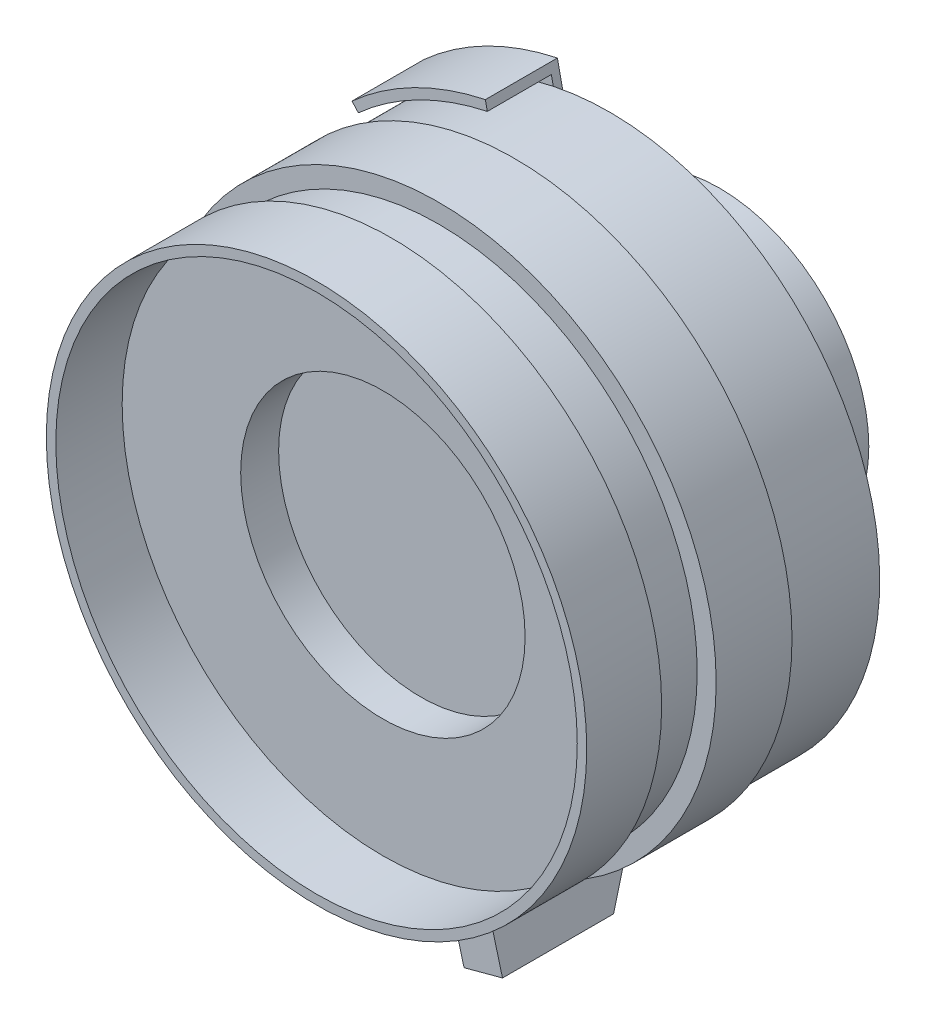
ISO-10303-21;
HEADER;
FILE_DESCRIPTION(('STEP AP214'),'2;1');
FILE_NAME('part.step','',(''),(''),'','','');
FILE_SCHEMA(('AUTOMOTIVE_DESIGN { 1 0 10303 214 1 1 1 1 }'));
ENDSEC;
DATA;
#1=APPLICATION_CONTEXT('core data for automotive mechanical design processes');
#2=APPLICATION_PROTOCOL_DEFINITION('international standard','automotive_design',2000,#1);
#3=PRODUCT_CONTEXT('',#1,'mechanical');
#4=PRODUCT('Part','Part','',(#3));
#5=PRODUCT_RELATED_PRODUCT_CATEGORY('part','',(#4));
#6=PRODUCT_DEFINITION_FORMATION('','',#4);
#7=PRODUCT_DEFINITION_CONTEXT('part definition',#1,'design');
#8=PRODUCT_DEFINITION('design','',#6,#7);
#9=PRODUCT_DEFINITION_SHAPE('','',#8);
#10=(LENGTH_UNIT() NAMED_UNIT(*) SI_UNIT(.MILLI.,.METRE.));
#11=(NAMED_UNIT(*) PLANE_ANGLE_UNIT() SI_UNIT($,.RADIAN.));
#12=(NAMED_UNIT(*) SI_UNIT($,.STERADIAN.) SOLID_ANGLE_UNIT());
#13=UNCERTAINTY_MEASURE_WITH_UNIT(LENGTH_MEASURE(1.E-05),#10,'distance_accuracy_value','');
#14=(GEOMETRIC_REPRESENTATION_CONTEXT(3) GLOBAL_UNCERTAINTY_ASSIGNED_CONTEXT((#13)) GLOBAL_UNIT_ASSIGNED_CONTEXT((#10,
#11,#12)) REPRESENTATION_CONTEXT('',''));
#15=CARTESIAN_POINT('',(0.,0.,0.));
#16=DIRECTION('',(0.,0.,1.));
#17=DIRECTION('',(1.,0.,0.));
#18=AXIS2_PLACEMENT_3D('',#15,#16,#17);
#19=CARTESIAN_POINT('',(0.,0.,11.6));
#20=DIRECTION('',(0.,0.,-1.));
#21=DIRECTION('',(-1.,0.,0.));
#22=AXIS2_PLACEMENT_3D('',#19,#20,#21);
#23=PLANE('',#22);
#24=CARTESIAN_POINT('',(0.,0.,11.6));
#25=DIRECTION('',(0.,0.,-1.));
#26=DIRECTION('',(1.,0.,0.));
#27=AXIS2_PLACEMENT_3D('',#24,#25,#26);
#28=CIRCLE('',#27,29.5);
#29=CARTESIAN_POINT('',(-19.7393528875864,21.922772351583,11.6));
#30=VERTEX_POINT('',#29);
#31=CARTESIAN_POINT('',(-6.13339487912422,28.8553542216472,11.6));
#32=VERTEX_POINT('',#31);
#33=EDGE_CURVE('E235',#30,#32,#28,.T.);
#34=ORIENTED_EDGE('',*,*,#33,.F.);
#35=DIRECTION('',(-0.669130606358862,0.743144825477391,0.));
#36=VECTOR('',#35,1.);
#37=CARTESIAN_POINT('',(-16.3936998557921,18.2070482241961,11.6));
#38=LINE('',#37,#36);
#39=CARTESIAN_POINT('',(-19.0702222812276,21.1796275261056,11.6));
#40=VERTEX_POINT('',#39);
#41=EDGE_CURVE('E271',#40,#30,#38,.T.);
#42=ORIENTED_EDGE('',*,*,#41,.F.);
#43=CARTESIAN_POINT('',(0.,0.,11.6));
#44=DIRECTION('',(0.,0.,1.));
#45=DIRECTION('',(1.,0.,0.));
#46=AXIS2_PLACEMENT_3D('',#43,#44,#45);
#47=CIRCLE('',#46,28.5);
#48=CARTESIAN_POINT('',(-5.92548318830645,27.8772066209134,11.6));
#49=VERTEX_POINT('',#48);
#50=EDGE_CURVE('E329',#49,#40,#47,.T.);
#51=ORIENTED_EDGE('',*,*,#50,.F.);
#52=DIRECTION('',(0.20791169081777,-0.978147600733803,0.));
#53=VECTOR('',#52,1.);
#54=CARTESIAN_POINT('',(-6.34130656994199,29.833501822381,11.6));
#55=LINE('',#54,#53);
#56=EDGE_CURVE('E246',#32,#49,#55,.T.);
#57=ORIENTED_EDGE('',*,*,#56,.F.);
#58=EDGE_LOOP('',(#34,#42,#51,#57));
#59=FACE_BOUND('',#58,.T.);
#60=ADVANCED_FACE('F41',(#59),#23,.F.);
#61=CARTESIAN_POINT('',(0.,0.,11.6));
#62=DIRECTION('',(0.,0.,1.));
#63=DIRECTION('',(1.,0.,0.));
#64=AXIS2_PLACEMENT_3D('',#61,#62,#63);
#65=PLANE('',#64);
#66=CARTESIAN_POINT('',(9.38473534577297,-26.9105321851835,11.6));
#67=VERTEX_POINT('',#66);
#68=EDGE_CURVE('E324',#67,#49,#47,.T.);
#69=ORIENTED_EDGE('',*,*,#68,.F.);
#70=DIRECTION('',(-0.258819045102524,0.965925826289068,0.));
#71=VECTOR('',#70,1.);
#72=CARTESIAN_POINT('',(2.02844423520706,0.543519994715305,11.6));
#73=LINE('',#72,#71);
#74=CARTESIAN_POINT('',(8.2162766283337,-22.5497848851535,11.6));
#75=VERTEX_POINT('',#74);
#76=EDGE_CURVE('E232',#67,#75,#73,.T.);
#77=ORIENTED_EDGE('',*,*,#76,.T.);
#78=CARTESIAN_POINT('',(0.,0.,11.6));
#79=DIRECTION('',(0.,0.,1.));
#80=DIRECTION('',(1.,0.,0.));
#81=AXIS2_PLACEMENT_3D('',#78,#79,#80);
#82=CIRCLE('',#81,24.);
#83=CARTESIAN_POINT('',(4.15938815791962,-23.6368248745841,11.6));
#84=VERTEX_POINT('',#83);
#85=EDGE_CURVE('E332',#75,#84,#82,.T.);
#86=ORIENTED_EDGE('',*,*,#85,.T.);
#87=DIRECTION('',(0.258819045102525,-0.965925826289067,0.));
#88=VECTOR('',#87,1.);
#89=CARTESIAN_POINT('',(-2.02844423520704,-0.543519994715302,11.6));
#90=LINE('',#89,#88);
#91=CARTESIAN_POINT('',(5.32784687535888,-27.9975721746142,11.6));
#92=VERTEX_POINT('',#91);
#93=EDGE_CURVE('E229',#84,#92,#90,.T.);
#94=ORIENTED_EDGE('',*,*,#93,.T.);
#95=EDGE_CURVE('E331',#40,#92,#47,.T.);
#96=ORIENTED_EDGE('',*,*,#95,.F.);
#97=CARTESIAN_POINT('',(-16.3936998557921,18.2070482241961,11.6));
#98=VERTEX_POINT('',#97);
#99=EDGE_CURVE('E259',#98,#40,#38,.T.);
#100=ORIENTED_EDGE('',*,*,#99,.F.);
#101=CARTESIAN_POINT('',(0.,0.,11.6));
#102=DIRECTION('',(0.,0.,1.));
#103=DIRECTION('',(-1.,0.,0.));
#104=AXIS2_PLACEMENT_3D('',#101,#102,#103);
#105=CIRCLE('',#104,24.5);
#106=CARTESIAN_POINT('',(-5.09383642503537,23.9646162179782,11.6));
#107=VERTEX_POINT('',#106);
#108=EDGE_CURVE('E268',#107,#98,#105,.T.);
#109=ORIENTED_EDGE('',*,*,#108,.F.);
#110=DIRECTION('',(0.20791169081777,-0.978147600733803,0.));
#111=VECTOR('',#110,1.);
#112=CARTESIAN_POINT('',(0.,0.,11.6));
#113=LINE('',#112,#111);
#114=EDGE_CURVE('E314',#49,#107,#113,.T.);
#115=ORIENTED_EDGE('',*,*,#114,.F.);
#116=EDGE_LOOP('',(#69,#77,#86,#94,#96,#100,#109,#115));
#117=FACE_BOUND('',#116,.T.);
#118=ADVANCED_FACE('F412',(#117),#65,.F.);
#119=CARTESIAN_POINT('',(0.,0.,4.5));
#120=DIRECTION('',(0.,0.,-1.));
#121=DIRECTION('',(-1.,0.,0.));
#122=AXIS2_PLACEMENT_3D('',#119,#120,#121);
#123=CYLINDRICAL_SURFACE('',#122,15.75);
#124=CARTESIAN_POINT('',(0.,0.,4.5));
#125=DIRECTION('',(0.,0.,1.));
#126=DIRECTION('',(1.,0.,0.));
#127=AXIS2_PLACEMENT_3D('',#124,#125,#126);
#128=CIRCLE('',#127,15.75);
#129=CARTESIAN_POINT('',(15.75,0.,4.5));
#130=VERTEX_POINT('',#129);
#131=EDGE_CURVE('E350',#130,#130,#128,.T.);
#132=ORIENTED_EDGE('',*,*,#131,.F.);
#133=EDGE_LOOP('',(#132));
#134=FACE_BOUND('',#133,.T.);
#135=CARTESIAN_POINT('',(0.,0.,0.));
#136=DIRECTION('',(0.,0.,1.));
#137=DIRECTION('',(1.,0.,0.));
#138=AXIS2_PLACEMENT_3D('',#135,#136,#137);
#139=CIRCLE('',#138,15.75);
#140=CARTESIAN_POINT('',(15.75,0.,0.));
#141=VERTEX_POINT('',#140);
#142=EDGE_CURVE('E347',#141,#141,#139,.T.);
#143=ORIENTED_EDGE('',*,*,#142,.T.);
#144=EDGE_LOOP('',(#143));
#145=FACE_BOUND('',#144,.T.);
#146=ADVANCED_FACE('F43',(#134,#145),#123,.T.);
#147=CARTESIAN_POINT('',(0.,0.,0.));
#148=DIRECTION('',(0.,0.,1.));
#149=DIRECTION('',(1.,0.,0.));
#150=AXIS2_PLACEMENT_3D('',#147,#148,#149);
#151=PLANE('',#150);
#152=CARTESIAN_POINT('',(0.,0.,0.));
#153=DIRECTION('',(0.,0.,-1.));
#154=DIRECTION('',(-1.,0.,0.));
#155=AXIS2_PLACEMENT_3D('',#152,#153,#154);
#156=CIRCLE('',#155,14.75);
#157=CARTESIAN_POINT('',(-14.75,0.,0.));
#158=VERTEX_POINT('',#157);
#159=EDGE_CURVE('E293',#158,#158,#156,.T.);
#160=ORIENTED_EDGE('',*,*,#159,.F.);
#161=EDGE_LOOP('',(#160));
#162=FACE_BOUND('',#161,.T.);
#163=ORIENTED_EDGE('',*,*,#142,.F.);
#164=EDGE_LOOP('',(#163));
#165=FACE_BOUND('',#164,.T.);
#166=ADVANCED_FACE('F550',(#162,#165),#151,.F.);
#167=CARTESIAN_POINT('',(0.,0.,10.5));
#168=DIRECTION('',(0.,0.,-1.));
#169=DIRECTION('',(-1.,0.,0.));
#170=AXIS2_PLACEMENT_3D('',#167,#168,#169);
#171=CYLINDRICAL_SURFACE('',#170,16.3);
#172=CARTESIAN_POINT('',(0.,0.,10.5));
#173=DIRECTION('',(0.,0.,1.));
#174=DIRECTION('',(1.,0.,0.));
#175=AXIS2_PLACEMENT_3D('',#172,#173,#174);
#176=CIRCLE('',#175,16.3);
#177=CARTESIAN_POINT('',(16.3,0.,10.5));
#178=VERTEX_POINT('',#177);
#179=EDGE_CURVE('E344',#178,#178,#176,.T.);
#180=ORIENTED_EDGE('',*,*,#179,.F.);
#181=EDGE_LOOP('',(#180));
#182=FACE_BOUND('',#181,.T.);
#183=CARTESIAN_POINT('',(0.,0.,4.5));
#184=DIRECTION('',(0.,0.,1.));
#185=DIRECTION('',(1.,0.,0.));
#186=AXIS2_PLACEMENT_3D('',#183,#184,#185);
#187=CIRCLE('',#186,16.3);
#188=CARTESIAN_POINT('',(16.3,0.,4.5));
#189=VERTEX_POINT('',#188);
#190=EDGE_CURVE('E341',#189,#189,#187,.T.);
#191=ORIENTED_EDGE('',*,*,#190,.T.);
#192=EDGE_LOOP('',(#191));
#193=FACE_BOUND('',#192,.T.);
#194=ADVANCED_FACE('F547',(#182,#193),#171,.T.);
#195=CARTESIAN_POINT('',(0.,0.,4.5));
#196=DIRECTION('',(0.,0.,1.));
#197=DIRECTION('',(1.,0.,0.));
#198=AXIS2_PLACEMENT_3D('',#195,#196,#197);
#199=PLANE('',#198);
#200=ORIENTED_EDGE('',*,*,#131,.T.);
#201=EDGE_LOOP('',(#200));
#202=FACE_BOUND('',#201,.T.);
#203=ORIENTED_EDGE('',*,*,#190,.F.);
#204=EDGE_LOOP('',(#203));
#205=FACE_BOUND('',#204,.T.);
#206=ADVANCED_FACE('F543',(#202,#205),#199,.F.);
#207=CARTESIAN_POINT('',(0.,0.,11.));
#208=DIRECTION('',(0.,0.,-1.));
#209=DIRECTION('',(-1.,0.,0.));
#210=AXIS2_PLACEMENT_3D('',#207,#208,#209);
#211=CYLINDRICAL_SURFACE('',#210,19.);
#212=CARTESIAN_POINT('',(0.,0.,11.));
#213=DIRECTION('',(0.,0.,1.));
#214=DIRECTION('',(1.,0.,0.));
#215=AXIS2_PLACEMENT_3D('',#212,#213,#214);
#216=CIRCLE('',#215,19.);
#217=CARTESIAN_POINT('',(19.,0.,11.));
#218=VERTEX_POINT('',#217);
#219=EDGE_CURVE('E338',#218,#218,#216,.T.);
#220=ORIENTED_EDGE('',*,*,#219,.F.);
#221=EDGE_LOOP('',(#220));
#222=FACE_BOUND('',#221,.T.);
#223=CARTESIAN_POINT('',(0.,0.,10.5));
#224=DIRECTION('',(0.,0.,1.));
#225=DIRECTION('',(1.,0.,0.));
#226=AXIS2_PLACEMENT_3D('',#223,#224,#225);
#227=CIRCLE('',#226,19.);
#228=CARTESIAN_POINT('',(19.,0.,10.5));
#229=VERTEX_POINT('',#228);
#230=EDGE_CURVE('E335',#229,#229,#227,.T.);
#231=ORIENTED_EDGE('',*,*,#230,.T.);
#232=EDGE_LOOP('',(#231));
#233=FACE_BOUND('',#232,.T.);
#234=ADVANCED_FACE('F539',(#222,#233),#211,.T.);
#235=CARTESIAN_POINT('',(0.,0.,10.5));
#236=DIRECTION('',(0.,0.,1.));
#237=DIRECTION('',(1.,0.,0.));
#238=AXIS2_PLACEMENT_3D('',#235,#236,#237);
#239=PLANE('',#238);
#240=CARTESIAN_POINT('',(-4.65874281184545,17.3866648732032,10.5));
#241=DIRECTION('',(0.,0.,1.));
#242=DIRECTION('',(1.,0.,0.));
#243=AXIS2_PLACEMENT_3D('',#240,#241,#242);
#244=CIRCLE('',#243,0.800000000000001);
#245=CARTESIAN_POINT('',(-3.85874281184545,17.3866648732032,10.5));
#246=VERTEX_POINT('',#245);
#247=EDGE_CURVE('E315',#246,#246,#244,.F.);
#248=ORIENTED_EDGE('',*,*,#247,.F.);
#249=EDGE_LOOP('',(#248));
#250=FACE_BOUND('',#249,.T.);
#251=ORIENTED_EDGE('',*,*,#179,.T.);
#252=EDGE_LOOP('',(#251));
#253=FACE_BOUND('',#252,.T.);
#254=ORIENTED_EDGE('',*,*,#230,.F.);
#255=EDGE_LOOP('',(#254));
#256=FACE_BOUND('',#255,.T.);
#257=ADVANCED_FACE('F536',(#250,#253,#256),#239,.F.);
#258=CARTESIAN_POINT('',(0.,0.,11.6));
#259=DIRECTION('',(0.,0.,-1.));
#260=DIRECTION('',(-1.,0.,0.));
#261=AXIS2_PLACEMENT_3D('',#258,#259,#260);
#262=CYLINDRICAL_SURFACE('',#261,24.);
#263=ORIENTED_EDGE('',*,*,#85,.F.);
#264=DIRECTION('',(0.,0.,-1.));
#265=VECTOR('',#264,1.);
#266=CARTESIAN_POINT('',(8.2162766283337,-22.5497848851535,31.0224073259564));
#267=LINE('',#266,#265);
#268=CARTESIAN_POINT('',(8.2162766283337,-22.5497848851535,11.));
#269=VERTEX_POINT('',#268);
#270=EDGE_CURVE('E224',#75,#269,#267,.T.);
#271=ORIENTED_EDGE('',*,*,#270,.T.);
#272=CARTESIAN_POINT('',(0.,0.,11.));
#273=DIRECTION('',(0.,0.,1.));
#274=DIRECTION('',(1.,0.,0.));
#275=AXIS2_PLACEMENT_3D('',#272,#273,#274);
#276=CIRCLE('',#275,24.);
#277=CARTESIAN_POINT('',(4.15938815791962,-23.6368248745841,11.));
#278=VERTEX_POINT('',#277);
#279=EDGE_CURVE('E328',#269,#278,#276,.T.);
#280=ORIENTED_EDGE('',*,*,#279,.T.);
#281=DIRECTION('',(0.,0.,-1.));
#282=VECTOR('',#281,1.);
#283=CARTESIAN_POINT('',(4.15938815791962,-23.6368248745841,31.0224073259564));
#284=LINE('',#283,#282);
#285=EDGE_CURVE('E221',#84,#278,#284,.T.);
#286=ORIENTED_EDGE('',*,*,#285,.F.);
#287=EDGE_LOOP('',(#263,#271,#280,#286));
#288=FACE_BOUND('',#287,.T.);
#289=ADVANCED_FACE('F409',(#288),#262,.T.);
#290=CARTESIAN_POINT('',(0.,0.,11.));
#291=DIRECTION('',(0.,0.,1.));
#292=DIRECTION('',(1.,0.,0.));
#293=AXIS2_PLACEMENT_3D('',#290,#291,#292);
#294=PLANE('',#293);
#295=ORIENTED_EDGE('',*,*,#219,.T.);
#296=EDGE_LOOP('',(#295));
#297=FACE_BOUND('',#296,.T.);
#298=ORIENTED_EDGE('',*,*,#279,.F.);
#299=DIRECTION('',(0.258819045102524,-0.965925826289067,0.));
#300=VECTOR('',#299,1.);
#301=CARTESIAN_POINT('',(8.2162766283337,-22.5497848851535,11.));
#302=LINE('',#301,#300);
#303=CARTESIAN_POINT('',(9.92242511083405,-28.9172177071013,11.));
#304=VERTEX_POINT('',#303);
#305=EDGE_CURVE('E207',#269,#304,#302,.T.);
#306=ORIENTED_EDGE('',*,*,#305,.T.);
#307=DIRECTION('',(-0.965925826289067,-0.258819045102525,0.));
#308=VECTOR('',#307,1.);
#309=CARTESIAN_POINT('',(9.92242511083405,-28.9172177071013,11.));
#310=LINE('',#309,#308);
#311=CARTESIAN_POINT('',(5.86553664041997,-30.0042576965319,11.));
#312=VERTEX_POINT('',#311);
#313=EDGE_CURVE('E212',#304,#312,#310,.T.);
#314=ORIENTED_EDGE('',*,*,#313,.T.);
#315=DIRECTION('',(-0.258819045102525,0.965925826289067,0.));
#316=VECTOR('',#315,1.);
#317=CARTESIAN_POINT('',(5.86553664041997,-30.0042576965319,11.));
#318=LINE('',#317,#316);
#319=EDGE_CURVE('E208',#312,#278,#318,.T.);
#320=ORIENTED_EDGE('',*,*,#319,.T.);
#321=EDGE_LOOP('',(#298,#306,#314,#320));
#322=FACE_BOUND('',#321,.T.);
#323=ADVANCED_FACE('F405',(#297,#322),#294,.F.);
#324=CARTESIAN_POINT('',(0.,0.,21.6));
#325=DIRECTION('',(0.,0.,-1.));
#326=DIRECTION('',(-1.,0.,0.));
#327=AXIS2_PLACEMENT_3D('',#324,#325,#326);
#328=CYLINDRICAL_SURFACE('',#327,28.5);
#329=CARTESIAN_POINT('',(0.,0.,21.6));
#330=DIRECTION('',(0.,0.,1.));
#331=DIRECTION('',(1.,0.,0.));
#332=AXIS2_PLACEMENT_3D('',#329,#330,#331);
#333=CIRCLE('',#332,28.5);
#334=CARTESIAN_POINT('',(28.5,0.,21.6));
#335=VERTEX_POINT('',#334);
#336=EDGE_CURVE('E325',#335,#335,#333,.T.);
#337=ORIENTED_EDGE('',*,*,#336,.F.);
#338=EDGE_LOOP('',(#337));
#339=FACE_BOUND('',#338,.T.);
#340=CARTESIAN_POINT('',(0.,0.,19.6));
#341=DIRECTION('',(0.,0.,1.));
#342=DIRECTION('',(1.,0.,0.));
#343=AXIS2_PLACEMENT_3D('',#340,#341,#342);
#344=CIRCLE('',#343,28.5);
#345=CARTESIAN_POINT('',(5.32784687535888,-27.9975721746142,19.6));
#346=VERTEX_POINT('',#345);
#347=CARTESIAN_POINT('',(9.38473534577297,-26.9105321851835,19.6));
#348=VERTEX_POINT('',#347);
#349=EDGE_CURVE('E362',#346,#348,#344,.T.);
#350=ORIENTED_EDGE('',*,*,#349,.T.);
#351=DIRECTION('',(0.,0.,-1.));
#352=VECTOR('',#351,1.);
#353=CARTESIAN_POINT('',(9.38473534577297,-26.9105321851835,21.6));
#354=LINE('',#353,#352);
#355=EDGE_CURVE('E365',#348,#67,#354,.T.);
#356=ORIENTED_EDGE('',*,*,#355,.T.);
#357=ORIENTED_EDGE('',*,*,#68,.T.);
#358=ORIENTED_EDGE('',*,*,#50,.T.);
#359=ORIENTED_EDGE('',*,*,#95,.T.);
#360=DIRECTION('',(0.,0.,-1.));
#361=VECTOR('',#360,1.);
#362=CARTESIAN_POINT('',(5.32784687535888,-27.9975721746142,21.6));
#363=LINE('',#362,#361);
#364=EDGE_CURVE('E359',#92,#346,#363,.F.);
#365=ORIENTED_EDGE('',*,*,#364,.T.);
#366=EDGE_LOOP('',(#350,#356,#357,#358,#359,#365));
#367=FACE_BOUND('',#366,.T.);
#368=ADVANCED_FACE('F418',(#339,#367),#328,.T.);
#369=CARTESIAN_POINT('',(-4.65874281184545,17.3866648732032,9.3));
#370=DIRECTION('',(0.,0.,1.));
#371=DIRECTION('',(1.,0.,0.));
#372=AXIS2_PLACEMENT_3D('',#369,#370,#371);
#373=CYLINDRICAL_SURFACE('',#372,0.800000000000001);
#374=CARTESIAN_POINT('',(-4.65874281184545,17.3866648732032,9.3));
#375=DIRECTION('',(0.,0.,-1.));
#376=DIRECTION('',(-1.,0.,0.));
#377=AXIS2_PLACEMENT_3D('',#374,#375,#376);
#378=CIRCLE('',#377,0.800000000000001);
#379=CARTESIAN_POINT('',(-5.45874281184545,17.3866648732032,9.3));
#380=VERTEX_POINT('',#379);
#381=EDGE_CURVE('E319',#380,#380,#378,.T.);
#382=ORIENTED_EDGE('',*,*,#381,.F.);
#383=EDGE_LOOP('',(#382));
#384=FACE_BOUND('',#383,.T.);
#385=ORIENTED_EDGE('',*,*,#247,.T.);
#386=EDGE_LOOP('',(#385));
#387=FACE_BOUND('',#386,.T.);
#388=ADVANCED_FACE('F523',(#384,#387),#373,.T.);
#389=CARTESIAN_POINT('',(-4.65874281184545,17.3866648732032,9.3));
#390=DIRECTION('',(0.,0.,-1.));
#391=DIRECTION('',(-1.,0.,0.));
#392=AXIS2_PLACEMENT_3D('',#389,#390,#391);
#393=PLANE('',#392);
#394=ORIENTED_EDGE('',*,*,#381,.T.);
#395=EDGE_LOOP('',(#394));
#396=FACE_BOUND('',#395,.T.);
#397=ADVANCED_FACE('F519',(#396),#393,.T.);
#398=CARTESIAN_POINT('',(0.,0.,29.6));
#399=DIRECTION('',(0.,0.,-1.));
#400=DIRECTION('',(-1.,0.,0.));
#401=AXIS2_PLACEMENT_3D('',#398,#399,#400);
#402=CYLINDRICAL_SURFACE('',#401,29.25);
#403=CARTESIAN_POINT('',(0.,0.,29.6));
#404=DIRECTION('',(0.,0.,1.));
#405=DIRECTION('',(1.,0.,0.));
#406=AXIS2_PLACEMENT_3D('',#403,#404,#405);
#407=CIRCLE('',#406,29.25);
#408=CARTESIAN_POINT('',(29.25,0.,29.6));
#409=VERTEX_POINT('',#408);
#410=EDGE_CURVE('E316',#409,#409,#407,.T.);
#411=ORIENTED_EDGE('',*,*,#410,.F.);
#412=EDGE_LOOP('',(#411));
#413=FACE_BOUND('',#412,.T.);
#414=CARTESIAN_POINT('',(0.,0.,21.6));
#415=DIRECTION('',(0.,0.,1.));
#416=DIRECTION('',(1.,0.,0.));
#417=AXIS2_PLACEMENT_3D('',#414,#415,#416);
#418=CIRCLE('',#417,29.25);
#419=CARTESIAN_POINT('',(29.25,0.,21.6));
#420=VERTEX_POINT('',#419);
#421=EDGE_CURVE('E310',#420,#420,#418,.T.);
#422=ORIENTED_EDGE('',*,*,#421,.T.);
#423=EDGE_LOOP('',(#422));
#424=FACE_BOUND('',#423,.T.);
#425=ADVANCED_FACE('F512',(#413,#424),#402,.T.);
#426=CARTESIAN_POINT('',(0.,0.,29.6));
#427=DIRECTION('',(0.,0.,1.));
#428=DIRECTION('',(1.,0.,0.));
#429=AXIS2_PLACEMENT_3D('',#426,#427,#428);
#430=PLANE('',#429);
#431=CARTESIAN_POINT('',(0.,0.,29.6));
#432=DIRECTION('',(0.,0.,1.));
#433=DIRECTION('',(1.,0.,0.));
#434=AXIS2_PLACEMENT_3D('',#431,#432,#433);
#435=CIRCLE('',#434,27.25);
#436=CARTESIAN_POINT('',(27.25,0.,29.6));
#437=VERTEX_POINT('',#436);
#438=EDGE_CURVE('E311',#437,#437,#435,.T.);
#439=ORIENTED_EDGE('',*,*,#438,.F.);
#440=EDGE_LOOP('',(#439));
#441=FACE_BOUND('',#440,.T.);
#442=ORIENTED_EDGE('',*,*,#410,.T.);
#443=EDGE_LOOP('',(#442));
#444=FACE_BOUND('',#443,.T.);
#445=ADVANCED_FACE('F509',(#441,#444),#430,.T.);
#446=CARTESIAN_POINT('',(0.,0.,21.6));
#447=DIRECTION('',(0.,0.,1.));
#448=DIRECTION('',(1.,0.,0.));
#449=AXIS2_PLACEMENT_3D('',#446,#447,#448);
#450=PLANE('',#449);
#451=ORIENTED_EDGE('',*,*,#336,.T.);
#452=EDGE_LOOP('',(#451));
#453=FACE_BOUND('',#452,.T.);
#454=ORIENTED_EDGE('',*,*,#421,.F.);
#455=EDGE_LOOP('',(#454));
#456=FACE_BOUND('',#455,.T.);
#457=ADVANCED_FACE('F508',(#453,#456),#450,.F.);
#458=CARTESIAN_POINT('',(0.,0.,34.6));
#459=DIRECTION('',(0.,0.,-1.));
#460=DIRECTION('',(-1.,0.,0.));
#461=AXIS2_PLACEMENT_3D('',#458,#459,#460);
#462=CYLINDRICAL_SURFACE('',#461,27.25);
#463=DIRECTION('',(0.,0.,-1.));
#464=VECTOR('',#463,1.);
#465=CARTESIAN_POINT('',(5.00340058436237,-26.7867221322879,34.6));
#466=LINE('',#465,#464);
#467=CARTESIAN_POINT('',(5.00340058436237,-26.7867221322879,30.1));
#468=VERTEX_POINT('',#467);
#469=CARTESIAN_POINT('',(5.00340058436236,-26.7867221322879,34.1));
#470=VERTEX_POINT('',#469);
#471=EDGE_CURVE('E205',#468,#470,#466,.F.);
#472=ORIENTED_EDGE('',*,*,#471,.T.);
#473=CARTESIAN_POINT('',(0.,0.,34.1));
#474=DIRECTION('',(0.,0.,1.));
#475=DIRECTION('',(1.,0.,0.));
#476=AXIS2_PLACEMENT_3D('',#473,#474,#475);
#477=CIRCLE('',#476,27.25);
#478=CARTESIAN_POINT('',(9.06028905477645,-25.6996821428573,34.1));
#479=VERTEX_POINT('',#478);
#480=EDGE_CURVE('E13',#470,#479,#477,.T.);
#481=ORIENTED_EDGE('',*,*,#480,.T.);
#482=DIRECTION('',(0.,0.,-1.));
#483=VECTOR('',#482,1.);
#484=CARTESIAN_POINT('',(9.06028905477646,-25.6996821428573,34.6));
#485=LINE('',#484,#483);
#486=CARTESIAN_POINT('',(9.06028905477646,-25.6996821428573,30.1));
#487=VERTEX_POINT('',#486);
#488=EDGE_CURVE('E202',#479,#487,#485,.T.);
#489=ORIENTED_EDGE('',*,*,#488,.T.);
#490=CARTESIAN_POINT('',(0.,0.,30.1));
#491=DIRECTION('',(0.,0.,-1.));
#492=DIRECTION('',(-1.,0.,0.));
#493=AXIS2_PLACEMENT_3D('',#490,#491,#492);
#494=CIRCLE('',#493,27.25);
#495=EDGE_CURVE('E49',#487,#468,#494,.T.);
#496=ORIENTED_EDGE('',*,*,#495,.T.);
#497=EDGE_LOOP('',(#472,#481,#489,#496));
#498=FACE_BOUND('',#497,.T.);
#499=CARTESIAN_POINT('',(0.,0.,34.6));
#500=DIRECTION('',(0.,0.,1.));
#501=DIRECTION('',(1.,0.,0.));
#502=AXIS2_PLACEMENT_3D('',#499,#500,#501);
#503=CIRCLE('',#502,27.25);
#504=CARTESIAN_POINT('',(27.25,0.,34.6));
#505=VERTEX_POINT('',#504);
#506=EDGE_CURVE('E307',#505,#505,#503,.T.);
#507=ORIENTED_EDGE('',*,*,#506,.F.);
#508=EDGE_LOOP('',(#507));
#509=FACE_BOUND('',#508,.T.);
#510=ORIENTED_EDGE('',*,*,#438,.T.);
#511=EDGE_LOOP('',(#510));
#512=FACE_BOUND('',#511,.T.);
#513=ADVANCED_FACE('F370',(#498,#509,#512),#462,.T.);
#514=CARTESIAN_POINT('',(0.,0.,165.610173055266));
#515=DIRECTION('',(0.,0.,-1.));
#516=DIRECTION('',(-1.,0.,0.));
#517=AXIS2_PLACEMENT_3D('',#514,#515,#516);
#518=CYLINDRICAL_SURFACE('',#517,28.5);
#519=CARTESIAN_POINT('',(0.,0.,34.6));
#520=DIRECTION('',(0.,0.,1.));
#521=DIRECTION('',(1.,0.,0.));
#522=AXIS2_PLACEMENT_3D('',#519,#520,#521);
#523=CIRCLE('',#522,28.5);
#524=CARTESIAN_POINT('',(28.5,0.,34.6));
#525=VERTEX_POINT('',#524);
#526=EDGE_CURVE('E299',#525,#525,#523,.T.);
#527=ORIENTED_EDGE('',*,*,#526,.T.);
#528=EDGE_LOOP('',(#527));
#529=FACE_BOUND('',#528,.T.);
#530=CARTESIAN_POINT('',(0.,0.,42.5));
#531=DIRECTION('',(0.,0.,1.));
#532=DIRECTION('',(1.,0.,0.));
#533=AXIS2_PLACEMENT_3D('',#530,#531,#532);
#534=CIRCLE('',#533,28.5);
#535=CARTESIAN_POINT('',(28.5,0.,42.5));
#536=VERTEX_POINT('',#535);
#537=EDGE_CURVE('E304',#536,#536,#534,.T.);
#538=ORIENTED_EDGE('',*,*,#537,.F.);
#539=EDGE_LOOP('',(#538));
#540=FACE_BOUND('',#539,.T.);
#541=ADVANCED_FACE('F498',(#529,#540),#518,.T.);
#542=CARTESIAN_POINT('',(0.,0.,34.6));
#543=DIRECTION('',(0.,0.,1.));
#544=DIRECTION('',(1.,0.,0.));
#545=AXIS2_PLACEMENT_3D('',#542,#543,#544);
#546=PLANE('',#545);
#547=ORIENTED_EDGE('',*,*,#506,.T.);
#548=EDGE_LOOP('',(#547));
#549=FACE_BOUND('',#548,.T.);
#550=ORIENTED_EDGE('',*,*,#526,.F.);
#551=EDGE_LOOP('',(#550));
#552=FACE_BOUND('',#551,.T.);
#553=ADVANCED_FACE('F495',(#549,#552),#546,.F.);
#554=CARTESIAN_POINT('',(0.,0.,42.5));
#555=DIRECTION('',(0.,0.,1.));
#556=DIRECTION('',(1.,0.,0.));
#557=AXIS2_PLACEMENT_3D('',#554,#555,#556);
#558=PLANE('',#557);
#559=CARTESIAN_POINT('',(0.,0.,42.5));
#560=DIRECTION('',(0.,0.,1.));
#561=DIRECTION('',(1.,0.,0.));
#562=AXIS2_PLACEMENT_3D('',#559,#560,#561);
#563=CIRCLE('',#562,27.5);
#564=CARTESIAN_POINT('',(27.5,0.,42.5));
#565=VERTEX_POINT('',#564);
#566=EDGE_CURVE('E287',#565,#565,#563,.T.);
#567=ORIENTED_EDGE('',*,*,#566,.F.);
#568=EDGE_LOOP('',(#567));
#569=FACE_BOUND('',#568,.T.);
#570=ORIENTED_EDGE('',*,*,#537,.T.);
#571=EDGE_LOOP('',(#570));
#572=FACE_BOUND('',#571,.T.);
#573=ADVANCED_FACE('F493',(#569,#572),#558,.T.);
#574=CARTESIAN_POINT('',(0.,0.,1.));
#575=DIRECTION('',(0.,0.,-1.));
#576=DIRECTION('',(-1.,0.,0.));
#577=AXIS2_PLACEMENT_3D('',#574,#575,#576);
#578=CYLINDRICAL_SURFACE('',#577,14.75);
#579=CARTESIAN_POINT('',(0.,0.,1.));
#580=DIRECTION('',(0.,0.,-1.));
#581=DIRECTION('',(-1.,0.,0.));
#582=AXIS2_PLACEMENT_3D('',#579,#580,#581);
#583=CIRCLE('',#582,14.75);
#584=CARTESIAN_POINT('',(-14.75,0.,1.));
#585=VERTEX_POINT('',#584);
#586=EDGE_CURVE('E296',#585,#585,#583,.T.);
#587=ORIENTED_EDGE('',*,*,#586,.F.);
#588=EDGE_LOOP('',(#587));
#589=FACE_BOUND('',#588,.T.);
#590=ORIENTED_EDGE('',*,*,#159,.T.);
#591=EDGE_LOOP('',(#590));
#592=FACE_BOUND('',#591,.T.);
#593=ADVANCED_FACE('F489',(#589,#592),#578,.F.);
#594=CARTESIAN_POINT('',(0.,0.,1.));
#595=DIRECTION('',(0.,0.,-1.));
#596=DIRECTION('',(-1.,0.,0.));
#597=AXIS2_PLACEMENT_3D('',#594,#595,#596);
#598=PLANE('',#597);
#599=ORIENTED_EDGE('',*,*,#586,.T.);
#600=EDGE_LOOP('',(#599));
#601=FACE_BOUND('',#600,.T.);
#602=ADVANCED_FACE('F485',(#601),#598,.T.);
#603=CARTESIAN_POINT('',(0.,0.,35.5));
#604=DIRECTION('',(0.,0.,1.));
#605=DIRECTION('',(1.,0.,0.));
#606=AXIS2_PLACEMENT_3D('',#603,#604,#605);
#607=CYLINDRICAL_SURFACE('',#606,27.5);
#608=CARTESIAN_POINT('',(0.,0.,35.5));
#609=DIRECTION('',(0.,0.,1.));
#610=DIRECTION('',(1.,0.,0.));
#611=AXIS2_PLACEMENT_3D('',#608,#609,#610);
#612=CIRCLE('',#611,27.5);
#613=CARTESIAN_POINT('',(27.5,0.,35.5));
#614=VERTEX_POINT('',#613);
#615=EDGE_CURVE('E290',#614,#614,#612,.T.);
#616=ORIENTED_EDGE('',*,*,#615,.F.);
#617=EDGE_LOOP('',(#616));
#618=FACE_BOUND('',#617,.T.);
#619=ORIENTED_EDGE('',*,*,#566,.T.);
#620=EDGE_LOOP('',(#619));
#621=FACE_BOUND('',#620,.T.);
#622=ADVANCED_FACE('F481',(#618,#621),#607,.F.);
#623=CARTESIAN_POINT('',(0.,0.,35.5));
#624=DIRECTION('',(0.,0.,1.));
#625=DIRECTION('',(1.,0.,0.));
#626=AXIS2_PLACEMENT_3D('',#623,#624,#625);
#627=PLANE('',#626);
#628=CARTESIAN_POINT('',(0.,0.,35.5));
#629=DIRECTION('',(0.,0.,1.));
#630=DIRECTION('',(1.,0.,0.));
#631=AXIS2_PLACEMENT_3D('',#628,#629,#630);
#632=CIRCLE('',#631,15.);
#633=CARTESIAN_POINT('',(15.,0.,35.5));
#634=VERTEX_POINT('',#633);
#635=EDGE_CURVE('E283',#634,#634,#632,.T.);
#636=ORIENTED_EDGE('',*,*,#635,.F.);
#637=EDGE_LOOP('',(#636));
#638=FACE_BOUND('',#637,.T.);
#639=ORIENTED_EDGE('',*,*,#615,.T.);
#640=EDGE_LOOP('',(#639));
#641=FACE_BOUND('',#640,.T.);
#642=ADVANCED_FACE('F477',(#638,#641),#627,.T.);
#643=CARTESIAN_POINT('',(0.,0.,31.5));
#644=DIRECTION('',(0.,0.,1.));
#645=DIRECTION('',(1.,0.,0.));
#646=AXIS2_PLACEMENT_3D('',#643,#644,#645);
#647=CYLINDRICAL_SURFACE('',#646,15.);
#648=CARTESIAN_POINT('',(0.,0.,31.5));
#649=DIRECTION('',(0.,0.,1.));
#650=DIRECTION('',(1.,0.,0.));
#651=AXIS2_PLACEMENT_3D('',#648,#649,#650);
#652=CIRCLE('',#651,15.);
#653=CARTESIAN_POINT('',(15.,0.,31.5));
#654=VERTEX_POINT('',#653);
#655=EDGE_CURVE('E284',#654,#654,#652,.T.);
#656=ORIENTED_EDGE('',*,*,#655,.F.);
#657=EDGE_LOOP('',(#656));
#658=FACE_BOUND('',#657,.T.);
#659=ORIENTED_EDGE('',*,*,#635,.T.);
#660=EDGE_LOOP('',(#659));
#661=FACE_BOUND('',#660,.T.);
#662=ADVANCED_FACE('F473',(#658,#661),#647,.F.);
#663=CARTESIAN_POINT('',(0.,0.,31.5));
#664=DIRECTION('',(0.,0.,1.));
#665=DIRECTION('',(1.,0.,0.));
#666=AXIS2_PLACEMENT_3D('',#663,#664,#665);
#667=PLANE('',#666);
#668=ORIENTED_EDGE('',*,*,#655,.T.);
#669=EDGE_LOOP('',(#668));
#670=FACE_BOUND('',#669,.T.);
#671=ADVANCED_FACE('F470',(#670),#667,.T.);
#672=CARTESIAN_POINT('',(0.,0.,10.75));
#673=DIRECTION('',(0.,0.,1.));
#674=DIRECTION('',(1.,0.,0.));
#675=AXIS2_PLACEMENT_3D('',#672,#673,#674);
#676=CYLINDRICAL_SURFACE('',#675,30.5);
#677=DIRECTION('',(0.,0.,1.));
#678=VECTOR('',#677,1.);
#679=CARTESIAN_POINT('',(-20.4084834939453,22.6659171770604,10.75));
#680=LINE('',#679,#678);
#681=CARTESIAN_POINT('',(-20.4084834939453,22.6659171770604,10.75));
#682=VERTEX_POINT('',#681);
#683=CARTESIAN_POINT('',(-20.4084834939453,22.6659171770604,18.35));
#684=VERTEX_POINT('',#683);
#685=EDGE_CURVE('E265',#682,#684,#680,.T.);
#686=ORIENTED_EDGE('',*,*,#685,.T.);
#687=CARTESIAN_POINT('',(0.,0.,18.35));
#688=DIRECTION('',(0.,0.,-1.));
#689=DIRECTION('',(-1.,0.,0.));
#690=AXIS2_PLACEMENT_3D('',#687,#688,#689);
#691=CIRCLE('',#690,30.5);
#692=CARTESIAN_POINT('',(-6.34130656994199,29.833501822381,18.35));
#693=VERTEX_POINT('',#692);
#694=EDGE_CURVE('E243',#684,#693,#691,.T.);
#695=ORIENTED_EDGE('',*,*,#694,.T.);
#696=DIRECTION('',(0.,0.,1.));
#697=VECTOR('',#696,1.);
#698=CARTESIAN_POINT('',(-6.34130656994199,29.833501822381,10.75));
#699=LINE('',#698,#697);
#700=CARTESIAN_POINT('',(-6.34130656994199,29.833501822381,10.75));
#701=VERTEX_POINT('',#700);
#702=EDGE_CURVE('E281',#701,#693,#699,.T.);
#703=ORIENTED_EDGE('',*,*,#702,.F.);
#704=CARTESIAN_POINT('',(0.,0.,10.75));
#705=DIRECTION('',(0.,0.,-1.));
#706=DIRECTION('',(-1.,0.,0.));
#707=AXIS2_PLACEMENT_3D('',#704,#705,#706);
#708=CIRCLE('',#707,30.5);
#709=EDGE_CURVE('E255',#682,#701,#708,.T.);
#710=ORIENTED_EDGE('',*,*,#709,.F.);
#711=EDGE_LOOP('',(#686,#695,#703,#710));
#712=FACE_BOUND('',#711,.T.);
#713=ADVANCED_FACE('F446',(#712),#676,.T.);
#714=CARTESIAN_POINT('',(-6.34130656994199,29.833501822381,10.75));
#715=DIRECTION('',(-0.978147600733803,-0.20791169081777,0.));
#716=DIRECTION('',(0.20791169081777,-0.978147600733803,0.));
#717=AXIS2_PLACEMENT_3D('',#714,#715,#716);
#718=PLANE('',#717);
#719=ORIENTED_EDGE('',*,*,#702,.T.);
#720=DIRECTION('',(0.20791169081777,-0.978147600733803,0.));
#721=VECTOR('',#720,1.);
#722=CARTESIAN_POINT('',(-6.13339487912422,28.8553542216472,18.35));
#723=LINE('',#722,#721);
#724=CARTESIAN_POINT('',(-6.13339487912422,28.8553542216472,18.35));
#725=VERTEX_POINT('',#724);
#726=EDGE_CURVE('E240',#693,#725,#723,.T.);
#727=ORIENTED_EDGE('',*,*,#726,.T.);
#728=DIRECTION('',(0.,0.,-1.));
#729=VECTOR('',#728,1.);
#730=CARTESIAN_POINT('',(-6.13339487912422,28.8553542216472,42.270471675817));
#731=LINE('',#730,#729);
#732=EDGE_CURVE('E249',#725,#32,#731,.T.);
#733=ORIENTED_EDGE('',*,*,#732,.T.);
#734=ORIENTED_EDGE('',*,*,#56,.T.);
#735=ORIENTED_EDGE('',*,*,#114,.T.);
#736=DIRECTION('',(0.,0.,1.));
#737=VECTOR('',#736,1.);
#738=CARTESIAN_POINT('',(-5.09383642503537,23.9646162179782,10.75));
#739=LINE('',#738,#737);
#740=CARTESIAN_POINT('',(-5.09383642503537,23.9646162179782,10.75));
#741=VERTEX_POINT('',#740);
#742=EDGE_CURVE('E278',#741,#107,#739,.T.);
#743=ORIENTED_EDGE('',*,*,#742,.F.);
#744=DIRECTION('',(0.20791169081777,-0.978147600733803,0.));
#745=VECTOR('',#744,1.);
#746=CARTESIAN_POINT('',(-6.34130656994199,29.833501822381,10.75));
#747=LINE('',#746,#745);
#748=EDGE_CURVE('E258',#701,#741,#747,.T.);
#749=ORIENTED_EDGE('',*,*,#748,.F.);
#750=EDGE_LOOP('',(#719,#727,#733,#734,#735,#743,#749));
#751=FACE_BOUND('',#750,.T.);
#752=ADVANCED_FACE('F435',(#751),#718,.F.);
#753=CARTESIAN_POINT('',(0.,0.,10.75));
#754=DIRECTION('',(0.,0.,1.));
#755=DIRECTION('',(1.,0.,0.));
#756=AXIS2_PLACEMENT_3D('',#753,#754,#755);
#757=CYLINDRICAL_SURFACE('',#756,24.5);
#758=ORIENTED_EDGE('',*,*,#108,.T.);
#759=DIRECTION('',(0.,0.,1.));
#760=VECTOR('',#759,1.);
#761=CARTESIAN_POINT('',(-16.3936998557921,18.2070482241961,10.75));
#762=LINE('',#761,#760);
#763=CARTESIAN_POINT('',(-16.3936998557921,18.2070482241961,10.75));
#764=VERTEX_POINT('',#763);
#765=EDGE_CURVE('E275',#764,#98,#762,.T.);
#766=ORIENTED_EDGE('',*,*,#765,.F.);
#767=CARTESIAN_POINT('',(0.,0.,10.75));
#768=DIRECTION('',(0.,0.,1.));
#769=DIRECTION('',(-1.,0.,0.));
#770=AXIS2_PLACEMENT_3D('',#767,#768,#769);
#771=CIRCLE('',#770,24.5);
#772=EDGE_CURVE('E261',#741,#764,#771,.T.);
#773=ORIENTED_EDGE('',*,*,#772,.F.);
#774=ORIENTED_EDGE('',*,*,#742,.T.);
#775=EDGE_LOOP('',(#758,#766,#773,#774));
#776=FACE_BOUND('',#775,.T.);
#777=ADVANCED_FACE('F432',(#776),#757,.F.);
#778=CARTESIAN_POINT('',(-16.3936998557921,18.2070482241961,10.75));
#779=DIRECTION('',(0.743144825477391,0.669130606358861,0.));
#780=DIRECTION('',(-0.669130606358862,0.743144825477391,0.));
#781=AXIS2_PLACEMENT_3D('',#778,#779,#780);
#782=PLANE('',#781);
#783=ORIENTED_EDGE('',*,*,#99,.T.);
#784=ORIENTED_EDGE('',*,*,#41,.T.);
#785=DIRECTION('',(0.,0.,-1.));
#786=VECTOR('',#785,1.);
#787=CARTESIAN_POINT('',(-19.7393528875864,21.922772351583,42.270471675817));
#788=LINE('',#787,#786);
#789=CARTESIAN_POINT('',(-19.7393528875864,21.922772351583,18.35));
#790=VERTEX_POINT('',#789);
#791=EDGE_CURVE('E251',#790,#30,#788,.T.);
#792=ORIENTED_EDGE('',*,*,#791,.F.);
#793=DIRECTION('',(-0.669130606358862,0.743144825477391,0.));
#794=VECTOR('',#793,1.);
#795=CARTESIAN_POINT('',(-20.4084834939453,22.6659171770604,18.35));
#796=LINE('',#795,#794);
#797=EDGE_CURVE('E239',#790,#684,#796,.T.);
#798=ORIENTED_EDGE('',*,*,#797,.T.);
#799=ORIENTED_EDGE('',*,*,#685,.F.);
#800=DIRECTION('',(-0.669130606358862,0.743144825477391,0.));
#801=VECTOR('',#800,1.);
#802=CARTESIAN_POINT('',(-16.3936998557921,18.2070482241961,10.75));
#803=LINE('',#802,#801);
#804=EDGE_CURVE('E263',#764,#682,#803,.T.);
#805=ORIENTED_EDGE('',*,*,#804,.F.);
#806=ORIENTED_EDGE('',*,*,#765,.T.);
#807=EDGE_LOOP('',(#783,#784,#792,#798,#799,#805,#806));
#808=FACE_BOUND('',#807,.T.);
#809=ADVANCED_FACE('F426',(#808),#782,.F.);
#810=CARTESIAN_POINT('',(0.,0.,10.75));
#811=DIRECTION('',(0.,0.,-1.));
#812=DIRECTION('',(-1.,0.,0.));
#813=AXIS2_PLACEMENT_3D('',#810,#811,#812);
#814=PLANE('',#813);
#815=ORIENTED_EDGE('',*,*,#709,.T.);
#816=ORIENTED_EDGE('',*,*,#748,.T.);
#817=ORIENTED_EDGE('',*,*,#772,.T.);
#818=ORIENTED_EDGE('',*,*,#804,.T.);
#819=EDGE_LOOP('',(#815,#816,#817,#818));
#820=FACE_BOUND('',#819,.T.);
#821=ADVANCED_FACE('F448',(#820),#814,.T.);
#822=CARTESIAN_POINT('',(0.,0.,42.270471675817));
#823=DIRECTION('',(0.,0.,-1.));
#824=DIRECTION('',(-1.,0.,0.));
#825=AXIS2_PLACEMENT_3D('',#822,#823,#824);
#826=CYLINDRICAL_SURFACE('',#825,29.5);
#827=ORIENTED_EDGE('',*,*,#732,.F.);
#828=CARTESIAN_POINT('',(0.,0.,18.35));
#829=DIRECTION('',(0.,0.,-1.));
#830=DIRECTION('',(-1.,0.,0.));
#831=AXIS2_PLACEMENT_3D('',#828,#829,#830);
#832=CIRCLE('',#831,29.5);
#833=EDGE_CURVE('E236',#725,#790,#832,.F.);
#834=ORIENTED_EDGE('',*,*,#833,.T.);
#835=ORIENTED_EDGE('',*,*,#791,.T.);
#836=ORIENTED_EDGE('',*,*,#33,.T.);
#837=EDGE_LOOP('',(#827,#834,#835,#836));
#838=FACE_BOUND('',#837,.T.);
#839=ADVANCED_FACE('F439',(#838),#826,.F.);
#840=CARTESIAN_POINT('',(0.,0.,18.35));
#841=DIRECTION('',(0.,0.,-1.));
#842=DIRECTION('',(-1.,0.,0.));
#843=AXIS2_PLACEMENT_3D('',#840,#841,#842);
#844=PLANE('',#843);
#845=ORIENTED_EDGE('',*,*,#797,.F.);
#846=ORIENTED_EDGE('',*,*,#833,.F.);
#847=ORIENTED_EDGE('',*,*,#726,.F.);
#848=ORIENTED_EDGE('',*,*,#694,.F.);
#849=EDGE_LOOP('',(#845,#846,#847,#848));
#850=FACE_BOUND('',#849,.T.);
#851=ADVANCED_FACE('F443',(#850),#844,.F.);
#852=CARTESIAN_POINT('',(8.2162766283337,-22.5497848851535,31.0224073259564));
#853=DIRECTION('',(0.965925826289067,0.258819045102524,0.));
#854=DIRECTION('',(-0.258819045102524,0.965925826289068,0.));
#855=AXIS2_PLACEMENT_3D('',#852,#853,#854);
#856=PLANE('',#855);
#857=DIRECTION('',(-0.224143868042017,0.836516303737809,-0.499999999999997));
#858=VECTOR('',#857,1.);
#859=CARTESIAN_POINT('',(11.2165203363467,-33.7468468385466,22.3867513459481));
#860=LINE('',#859,#858);
#861=CARTESIAN_POINT('',(11.2165203363467,-33.7468468385466,22.3867513459481));
#862=VERTEX_POINT('',#861);
#863=CARTESIAN_POINT('',(9.92242511083406,-28.9172177071013,19.5));
#864=VERTEX_POINT('',#863);
#865=EDGE_CURVE('E382',#862,#864,#860,.T.);
#866=ORIENTED_EDGE('',*,*,#865,.T.);
#867=DIRECTION('',(0.,0.,-1.));
#868=VECTOR('',#867,1.);
#869=CARTESIAN_POINT('',(9.92242511083405,-28.9172177071013,31.0224073259564));
#870=LINE('',#869,#868);
#871=EDGE_CURVE('E218',#864,#304,#870,.T.);
#872=ORIENTED_EDGE('',*,*,#871,.T.);
#873=ORIENTED_EDGE('',*,*,#305,.F.);
#874=ORIENTED_EDGE('',*,*,#270,.F.);
#875=ORIENTED_EDGE('',*,*,#76,.F.);
#876=ORIENTED_EDGE('',*,*,#355,.F.);
#877=DIRECTION('',(0.258819045102524,-0.965925826289068,0.));
#878=VECTOR('',#877,1.);
#879=CARTESIAN_POINT('',(8.2162766283337,-22.5497848851535,19.6));
#880=LINE('',#879,#878);
#881=CARTESIAN_POINT('',(9.72831082700716,-28.1927733373845,19.6));
#882=VERTEX_POINT('',#881);
#883=EDGE_CURVE('E211',#348,#882,#880,.T.);
#884=ORIENTED_EDGE('',*,*,#883,.T.);
#885=DIRECTION('',(0.,0.,1.));
#886=VECTOR('',#885,1.);
#887=CARTESIAN_POINT('',(9.72831082700717,-28.1927733373845,19.5));
#888=LINE('',#887,#886);
#889=CARTESIAN_POINT('',(9.72831082700717,-28.1927733373845,30.1));
#890=VERTEX_POINT('',#889);
#891=EDGE_CURVE('E379',#882,#890,#888,.T.);
#892=ORIENTED_EDGE('',*,*,#891,.T.);
#893=DIRECTION('',(-0.258819045102525,0.965925826289067,0.));
#894=VECTOR('',#893,1.);
#895=CARTESIAN_POINT('',(9.72831082700717,-28.1927733373845,30.1));
#896=LINE('',#895,#894);
#897=EDGE_CURVE('E183',#890,#487,#896,.T.);
#898=ORIENTED_EDGE('',*,*,#897,.T.);
#899=ORIENTED_EDGE('',*,*,#488,.F.);
#900=DIRECTION('',(0.258819045102524,-0.965925826289067,0.));
#901=VECTOR('',#900,1.);
#902=CARTESIAN_POINT('',(8.5636251240458,-23.8461071190837,34.1));
#903=LINE('',#902,#901);
#904=CARTESIAN_POINT('',(11.2165203363467,-33.7468468385466,34.1));
#905=VERTEX_POINT('',#904);
#906=EDGE_CURVE('E387',#479,#905,#903,.T.);
#907=ORIENTED_EDGE('',*,*,#906,.T.);
#908=DIRECTION('',(0.,0.,-1.));
#909=VECTOR('',#908,1.);
#910=CARTESIAN_POINT('',(11.2165203363467,-33.7468468385466,34.1));
#911=LINE('',#910,#909);
#912=EDGE_CURVE('E197',#905,#862,#911,.T.);
#913=ORIENTED_EDGE('',*,*,#912,.T.);
#914=EDGE_LOOP('',(#866,#872,#873,#874,#875,#876,#884,#892,#898,#899,#907,#913));
#915=FACE_BOUND('',#914,.T.);
#916=ADVANCED_FACE('F377',(#915),#856,.T.);
#917=CARTESIAN_POINT('',(5.86553664041997,-30.0042576965319,31.0224073259564));
#918=DIRECTION('',(-0.965925826289067,-0.258819045102525,0.));
#919=DIRECTION('',(0.258819045102525,-0.965925826289067,0.));
#920=AXIS2_PLACEMENT_3D('',#917,#918,#919);
#921=PLANE('',#920);
#922=DIRECTION('',(0.,0.,-1.));
#923=VECTOR('',#922,1.);
#924=CARTESIAN_POINT('',(5.86553664041997,-30.0042576965319,31.0224073259564));
#925=LINE('',#924,#923);
#926=CARTESIAN_POINT('',(5.86553664041997,-30.0042576965319,19.5));
#927=VERTEX_POINT('',#926);
#928=EDGE_CURVE('E222',#927,#312,#925,.T.);
#929=ORIENTED_EDGE('',*,*,#928,.F.);
#930=DIRECTION('',(-0.224143868042017,0.836516303737809,-0.499999999999997));
#931=VECTOR('',#930,1.);
#932=CARTESIAN_POINT('',(7.15963186593259,-34.8338868279772,22.3867513459481));
#933=LINE('',#932,#931);
#934=CARTESIAN_POINT('',(7.15963186593259,-34.8338868279772,22.3867513459481));
#935=VERTEX_POINT('',#934);
#936=EDGE_CURVE('E190',#935,#927,#933,.T.);
#937=ORIENTED_EDGE('',*,*,#936,.F.);
#938=DIRECTION('',(0.,0.,-1.));
#939=VECTOR('',#938,1.);
#940=CARTESIAN_POINT('',(7.15963186593259,-34.8338868279772,34.1));
#941=LINE('',#940,#939);
#942=CARTESIAN_POINT('',(7.15963186593259,-34.8338868279772,34.1));
#943=VERTEX_POINT('',#942);
#944=EDGE_CURVE('E186',#943,#935,#941,.T.);
#945=ORIENTED_EDGE('',*,*,#944,.F.);
#946=DIRECTION('',(0.258819045102525,-0.965925826289067,0.));
#947=VECTOR('',#946,1.);
#948=CARTESIAN_POINT('',(4.50673665363171,-24.9331471085143,34.1));
#949=LINE('',#948,#947);
#950=EDGE_CURVE('E174',#470,#943,#949,.T.);
#951=ORIENTED_EDGE('',*,*,#950,.F.);
#952=ORIENTED_EDGE('',*,*,#471,.F.);
#953=DIRECTION('',(-0.258819045102525,0.965925826289067,0.));
#954=VECTOR('',#953,1.);
#955=CARTESIAN_POINT('',(5.67142235659307,-29.2798133268151,30.1));
#956=LINE('',#955,#954);
#957=CARTESIAN_POINT('',(5.67142235659307,-29.2798133268151,30.1));
#958=VERTEX_POINT('',#957);
#959=EDGE_CURVE('E56',#958,#468,#956,.T.);
#960=ORIENTED_EDGE('',*,*,#959,.F.);
#961=DIRECTION('',(0.,0.,1.));
#962=VECTOR('',#961,1.);
#963=CARTESIAN_POINT('',(5.67142235659307,-29.2798133268151,19.5));
#964=LINE('',#963,#962);
#965=CARTESIAN_POINT('',(5.67142235659307,-29.2798133268151,19.6));
#966=VERTEX_POINT('',#965);
#967=EDGE_CURVE('E391',#966,#958,#964,.T.);
#968=ORIENTED_EDGE('',*,*,#967,.F.);
#969=DIRECTION('',(-0.258819045102525,0.965925826289067,0.));
#970=VECTOR('',#969,1.);
#971=CARTESIAN_POINT('',(5.86553664041997,-30.0042576965319,19.6));
#972=LINE('',#971,#970);
#973=EDGE_CURVE('E219',#966,#346,#972,.T.);
#974=ORIENTED_EDGE('',*,*,#973,.T.);
#975=ORIENTED_EDGE('',*,*,#364,.F.);
#976=ORIENTED_EDGE('',*,*,#93,.F.);
#977=ORIENTED_EDGE('',*,*,#285,.T.);
#978=ORIENTED_EDGE('',*,*,#319,.F.);
#979=EDGE_LOOP('',(#929,#937,#945,#951,#952,#960,#968,#974,#975,#976,#977,#978));
#980=FACE_BOUND('',#979,.T.);
#981=ADVANCED_FACE('F188',(#980),#921,.T.);
#982=CARTESIAN_POINT('',(0.,0.,19.6));
#983=DIRECTION('',(0.,0.,1.));
#984=DIRECTION('',(1.,0.,0.));
#985=AXIS2_PLACEMENT_3D('',#982,#983,#984);
#986=PLANE('',#985);
#987=DIRECTION('',(-0.965925826289067,-0.258819045102524,0.));
#988=VECTOR('',#987,1.);
#989=CARTESIAN_POINT('',(7.6998665918001,-28.7362933320998,19.6));
#990=LINE('',#989,#988);
#991=EDGE_CURVE('E64',#882,#966,#990,.T.);
#992=ORIENTED_EDGE('',*,*,#991,.F.);
#993=ORIENTED_EDGE('',*,*,#883,.F.);
#994=ORIENTED_EDGE('',*,*,#349,.F.);
#995=ORIENTED_EDGE('',*,*,#973,.F.);
#996=EDGE_LOOP('',(#992,#993,#994,#995));
#997=FACE_BOUND('',#996,.T.);
#998=ADVANCED_FACE('F599',(#997),#986,.T.);
#999=CARTESIAN_POINT('',(9.92242511083405,-28.9172177071013,31.0224073259564));
#1000=DIRECTION('',(0.258819045102525,-0.965925826289067,0.));
#1001=DIRECTION('',(0.965925826289067,0.258819045102525,0.));
#1002=AXIS2_PLACEMENT_3D('',#999,#1000,#1001);
#1003=PLANE('',#1002);
#1004=DIRECTION('',(0.965925826289067,0.258819045102524,0.));
#1005=VECTOR('',#1004,1.);
#1006=CARTESIAN_POINT('',(-11.3654132616573,-34.6212768076147,19.5));
#1007=LINE('',#1006,#1005);
#1008=EDGE_CURVE('E393',#927,#864,#1007,.T.);
#1009=ORIENTED_EDGE('',*,*,#1008,.F.);
#1010=ORIENTED_EDGE('',*,*,#928,.T.);
#1011=ORIENTED_EDGE('',*,*,#313,.F.);
#1012=ORIENTED_EDGE('',*,*,#871,.F.);
#1013=EDGE_LOOP('',(#1009,#1010,#1011,#1012));
#1014=FACE_BOUND('',#1013,.T.);
#1015=ADVANCED_FACE('F401',(#1014),#1003,.T.);
#1016=CARTESIAN_POINT('',(-12.7242132484456,-29.5501662195971,34.1));
#1017=DIRECTION('',(0.,0.,1.));
#1018=DIRECTION('',(1.,0.,0.));
#1019=AXIS2_PLACEMENT_3D('',#1016,#1017,#1018);
#1020=PLANE('',#1019);
#1021=ORIENTED_EDGE('',*,*,#480,.F.);
#1022=ORIENTED_EDGE('',*,*,#950,.T.);
#1023=DIRECTION('',(0.965925826289067,0.258819045102524,0.));
#1024=VECTOR('',#1023,1.);
#1025=CARTESIAN_POINT('',(-10.0713180361447,-39.45090593906,34.1));
#1026=LINE('',#1025,#1024);
#1027=EDGE_CURVE('E179',#943,#905,#1026,.T.);
#1028=ORIENTED_EDGE('',*,*,#1027,.T.);
#1029=ORIENTED_EDGE('',*,*,#906,.F.);
#1030=EDGE_LOOP('',(#1021,#1022,#1028,#1029));
#1031=FACE_BOUND('',#1030,.T.);
#1032=ADVANCED_FACE('F176',(#1031),#1020,.T.);
#1033=CARTESIAN_POINT('',(-10.0713180361447,-39.45090593906,34.1));
#1034=DIRECTION('',(0.258819045102524,-0.965925826289067,0.));
#1035=DIRECTION('',(0.965925826289067,0.258819045102524,0.));
#1036=AXIS2_PLACEMENT_3D('',#1033,#1034,#1035);
#1037=PLANE('',#1036);
#1038=ORIENTED_EDGE('',*,*,#1027,.F.);
#1039=ORIENTED_EDGE('',*,*,#944,.T.);
#1040=DIRECTION('',(0.965925826289067,0.258819045102524,0.));
#1041=VECTOR('',#1040,1.);
#1042=CARTESIAN_POINT('',(-10.0713180361447,-39.45090593906,22.3867513459481));
#1043=LINE('',#1042,#1041);
#1044=EDGE_CURVE('E193',#935,#862,#1043,.T.);
#1045=ORIENTED_EDGE('',*,*,#1044,.T.);
#1046=ORIENTED_EDGE('',*,*,#912,.F.);
#1047=EDGE_LOOP('',(#1038,#1039,#1045,#1046));
#1048=FACE_BOUND('',#1047,.T.);
#1049=ADVANCED_FACE('F195',(#1048),#1037,.T.);
#1050=CARTESIAN_POINT('',(-10.0713180361447,-39.45090593906,22.3867513459481));
#1051=DIRECTION('',(0.129409522551262,-0.482962913144531,-0.86602540378444));
#1052=DIRECTION('',(0.,0.873369362327713,-0.487058473848146));
#1053=AXIS2_PLACEMENT_3D('',#1050,#1051,#1052);
#1054=PLANE('',#1053);
#1055=ORIENTED_EDGE('',*,*,#1044,.F.);
#1056=ORIENTED_EDGE('',*,*,#936,.T.);
#1057=ORIENTED_EDGE('',*,*,#1008,.T.);
#1058=ORIENTED_EDGE('',*,*,#865,.F.);
#1059=EDGE_LOOP('',(#1055,#1056,#1057,#1058));
#1060=FACE_BOUND('',#1059,.T.);
#1061=ADVANCED_FACE('F398',(#1060),#1054,.T.);
#1062=CARTESIAN_POINT('',(-11.5595275454842,-33.8968324378979,19.5));
#1063=DIRECTION('',(-0.258819045102524,0.965925826289067,0.));
#1064=DIRECTION('',(-0.965925826289067,-0.258819045102524,0.));
#1065=AXIS2_PLACEMENT_3D('',#1062,#1063,#1064);
#1066=PLANE('',#1065);
#1067=ORIENTED_EDGE('',*,*,#891,.F.);
#1068=ORIENTED_EDGE('',*,*,#991,.T.);
#1069=ORIENTED_EDGE('',*,*,#967,.T.);
#1070=DIRECTION('',(0.965925826289067,0.258819045102524,0.));
#1071=VECTOR('',#1070,1.);
#1072=CARTESIAN_POINT('',(-11.5595275454842,-33.8968324378979,30.1));
#1073=LINE('',#1072,#1071);
#1074=EDGE_CURVE('E390',#958,#890,#1073,.T.);
#1075=ORIENTED_EDGE('',*,*,#1074,.T.);
#1076=EDGE_LOOP('',(#1067,#1068,#1069,#1075));
#1077=FACE_BOUND('',#1076,.T.);
#1078=ADVANCED_FACE('F630',(#1077),#1066,.T.);
#1079=CARTESIAN_POINT('',(-11.5595275454842,-33.8968324378979,30.1));
#1080=DIRECTION('',(0.,0.,-1.));
#1081=DIRECTION('',(-1.,0.,0.));
#1082=AXIS2_PLACEMENT_3D('',#1079,#1080,#1081);
#1083=PLANE('',#1082);
#1084=ORIENTED_EDGE('',*,*,#495,.F.);
#1085=ORIENTED_EDGE('',*,*,#897,.F.);
#1086=ORIENTED_EDGE('',*,*,#1074,.F.);
#1087=ORIENTED_EDGE('',*,*,#959,.T.);
#1088=EDGE_LOOP('',(#1084,#1085,#1086,#1087));
#1089=FACE_BOUND('',#1088,.T.);
#1090=ADVANCED_FACE('F374',(#1089),#1083,.T.);
#1091=CLOSED_SHELL('',(#60,#118,#146,#166,#194,#206,#234,#257,#289,#323,#368,#388,#397,#425,
#445,#457,#513,#541,#553,#573,#593,#602,#622,#642,#662,#671,#713,#752,#777,#809,#821,#839,#851,
#916,#981,#998,#1015,#1032,#1049,#1061,#1078,#1090));
#1092=MANIFOLD_SOLID_BREP('B2',#1091);
#1093=ADVANCED_BREP_SHAPE_REPRESENTATION('',(#18,#1092),#14);
#1094=SHAPE_DEFINITION_REPRESENTATION(#9,#1093);
ENDSEC;
END-ISO-10303-21;
